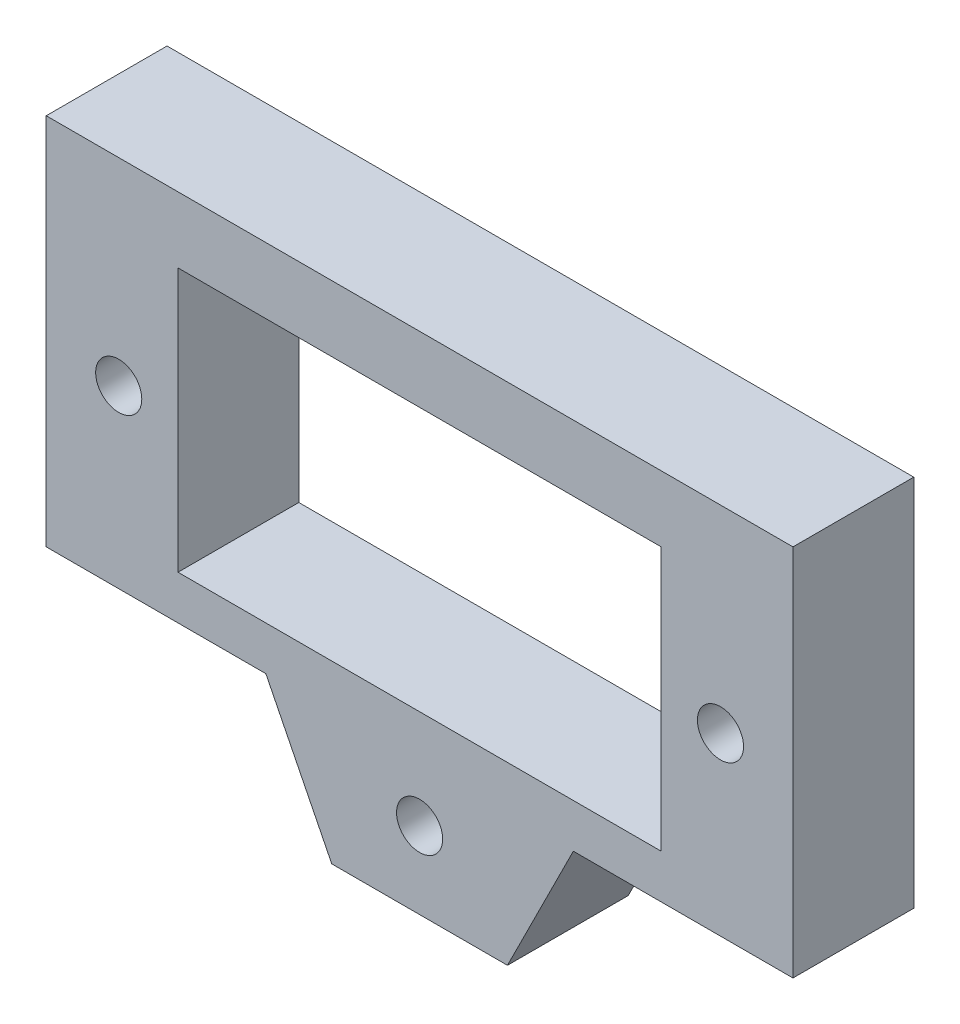
ISO-10303-21;
HEADER;
FILE_DESCRIPTION(('STEP AP214'),'2;1');
FILE_NAME('part.step','',(''),(''),'','','');
FILE_SCHEMA(('AUTOMOTIVE_DESIGN { 1 0 10303 214 1 1 1 1 }'));
ENDSEC;
DATA;
#1=APPLICATION_CONTEXT('core data for automotive mechanical design processes');
#2=APPLICATION_PROTOCOL_DEFINITION('international standard','automotive_design',2000,#1);
#3=PRODUCT_CONTEXT('',#1,'mechanical');
#4=PRODUCT('Part','Part','',(#3));
#5=PRODUCT_RELATED_PRODUCT_CATEGORY('part','',(#4));
#6=PRODUCT_DEFINITION_FORMATION('','',#4);
#7=PRODUCT_DEFINITION_CONTEXT('part definition',#1,'design');
#8=PRODUCT_DEFINITION('design','',#6,#7);
#9=PRODUCT_DEFINITION_SHAPE('','',#8);
#10=(LENGTH_UNIT() NAMED_UNIT(*) SI_UNIT(.MILLI.,.METRE.));
#11=(NAMED_UNIT(*) PLANE_ANGLE_UNIT() SI_UNIT($,.RADIAN.));
#12=(NAMED_UNIT(*) SI_UNIT($,.STERADIAN.) SOLID_ANGLE_UNIT());
#13=UNCERTAINTY_MEASURE_WITH_UNIT(LENGTH_MEASURE(1.E-05),#10,'distance_accuracy_value','');
#14=(GEOMETRIC_REPRESENTATION_CONTEXT(3) GLOBAL_UNCERTAINTY_ASSIGNED_CONTEXT((#13)) GLOBAL_UNIT_ASSIGNED_CONTEXT((#10,
#11,#12)) REPRESENTATION_CONTEXT('',''));
#15=CARTESIAN_POINT('',(0.,0.,0.));
#16=DIRECTION('',(0.,0.,1.));
#17=DIRECTION('',(1.,0.,0.));
#18=AXIS2_PLACEMENT_3D('',#15,#16,#17);
#19=CARTESIAN_POINT('',(0.,0.,5.5));
#20=DIRECTION('',(0.,0.,1.));
#21=DIRECTION('',(1.,0.,0.));
#22=AXIS2_PLACEMENT_3D('',#19,#20,#21);
#23=PLANE('',#22);
#24=CARTESIAN_POINT('',(13.7,0.,5.5));
#25=DIRECTION('',(0.,0.,1.));
#26=DIRECTION('',(1.,0.,0.));
#27=AXIS2_PLACEMENT_3D('',#24,#25,#26);
#28=CIRCLE('',#27,1.05);
#29=CARTESIAN_POINT('',(14.75,0.,5.5));
#30=VERTEX_POINT('',#29);
#31=EDGE_CURVE('E313',#30,#30,#28,.T.);
#32=ORIENTED_EDGE('',*,*,#31,.F.);
#33=EDGE_LOOP('',(#32));
#34=FACE_BOUND('',#33,.T.);
#35=DIRECTION('',(1.,0.,0.));
#36=VECTOR('',#35,1.);
#37=CARTESIAN_POINT('',(11.,-6.,5.5));
#38=LINE('',#37,#36);
#39=CARTESIAN_POINT('',(-11.,-6.,5.5));
#40=VERTEX_POINT('',#39);
#41=CARTESIAN_POINT('',(11.,-6.,5.5));
#42=VERTEX_POINT('',#41);
#43=EDGE_CURVE('E129',#40,#42,#38,.T.);
#44=ORIENTED_EDGE('',*,*,#43,.F.);
#45=DIRECTION('',(0.,-1.,0.));
#46=VECTOR('',#45,1.);
#47=CARTESIAN_POINT('',(-11.,6.,5.5));
#48=LINE('',#47,#46);
#49=CARTESIAN_POINT('',(-11.,6.,5.5));
#50=VERTEX_POINT('',#49);
#51=EDGE_CURVE('E121',#50,#40,#48,.T.);
#52=ORIENTED_EDGE('',*,*,#51,.F.);
#53=DIRECTION('',(-1.,0.,0.));
#54=VECTOR('',#53,1.);
#55=CARTESIAN_POINT('',(11.,6.,5.5));
#56=LINE('',#55,#54);
#57=CARTESIAN_POINT('',(11.,6.,5.5));
#58=VERTEX_POINT('',#57);
#59=EDGE_CURVE('E144',#58,#50,#56,.T.);
#60=ORIENTED_EDGE('',*,*,#59,.F.);
#61=DIRECTION('',(0.,1.,0.));
#62=VECTOR('',#61,1.);
#63=CARTESIAN_POINT('',(11.,6.,5.5));
#64=LINE('',#63,#62);
#65=EDGE_CURVE('E142',#42,#58,#64,.T.);
#66=ORIENTED_EDGE('',*,*,#65,.F.);
#67=EDGE_LOOP('',(#44,#52,#60,#66));
#68=FACE_BOUND('',#67,.T.);
#69=DIRECTION('',(0.,-1.,0.));
#70=VECTOR('',#69,1.);
#71=CARTESIAN_POINT('',(-17.,9.,5.5));
#72=LINE('',#71,#70);
#73=CARTESIAN_POINT('',(-17.,9.,5.5));
#74=VERTEX_POINT('',#73);
#75=CARTESIAN_POINT('',(-17.,-8.,5.5));
#76=VERTEX_POINT('',#75);
#77=EDGE_CURVE('E160',#74,#76,#72,.T.);
#78=ORIENTED_EDGE('',*,*,#77,.T.);
#79=DIRECTION('',(1.,0.,0.));
#80=VECTOR('',#79,1.);
#81=CARTESIAN_POINT('',(-17.,-8.,5.5));
#82=LINE('',#81,#80);
#83=CARTESIAN_POINT('',(-7.,-8.,5.5));
#84=VERTEX_POINT('',#83);
#85=EDGE_CURVE('E163',#76,#84,#82,.T.);
#86=ORIENTED_EDGE('',*,*,#85,.T.);
#87=DIRECTION('',(0.447213595499958,-0.894427190999916,0.));
#88=VECTOR('',#87,1.);
#89=CARTESIAN_POINT('',(-7.,-8.,5.5));
#90=LINE('',#89,#88);
#91=CARTESIAN_POINT('',(-4.,-14.,5.5));
#92=VERTEX_POINT('',#91);
#93=EDGE_CURVE('E166',#84,#92,#90,.T.);
#94=ORIENTED_EDGE('',*,*,#93,.T.);
#95=DIRECTION('',(1.,0.,0.));
#96=VECTOR('',#95,1.);
#97=CARTESIAN_POINT('',(-4.,-14.,5.5));
#98=LINE('',#97,#96);
#99=CARTESIAN_POINT('',(4.,-14.,5.5));
#100=VERTEX_POINT('',#99);
#101=EDGE_CURVE('E168',#92,#100,#98,.T.);
#102=ORIENTED_EDGE('',*,*,#101,.T.);
#103=DIRECTION('',(0.447213595499957,0.894427190999916,0.));
#104=VECTOR('',#103,1.);
#105=CARTESIAN_POINT('',(4.,-14.,5.5));
#106=LINE('',#105,#104);
#107=CARTESIAN_POINT('',(6.99999999999999,-8.,5.5));
#108=VERTEX_POINT('',#107);
#109=EDGE_CURVE('E170',#100,#108,#106,.T.);
#110=ORIENTED_EDGE('',*,*,#109,.T.);
#111=DIRECTION('',(1.,0.,0.));
#112=VECTOR('',#111,1.);
#113=CARTESIAN_POINT('',(6.99999999999999,-8.,5.5));
#114=LINE('',#113,#112);
#115=CARTESIAN_POINT('',(17.,-8.,5.5));
#116=VERTEX_POINT('',#115);
#117=EDGE_CURVE('E172',#108,#116,#114,.T.);
#118=ORIENTED_EDGE('',*,*,#117,.T.);
#119=DIRECTION('',(0.,1.,0.));
#120=VECTOR('',#119,1.);
#121=CARTESIAN_POINT('',(17.,9.,5.5));
#122=LINE('',#121,#120);
#123=CARTESIAN_POINT('',(17.,9.,5.5));
#124=VERTEX_POINT('',#123);
#125=EDGE_CURVE('E174',#116,#124,#122,.T.);
#126=ORIENTED_EDGE('',*,*,#125,.T.);
#127=DIRECTION('',(-1.,0.,0.));
#128=VECTOR('',#127,1.);
#129=CARTESIAN_POINT('',(-17.,9.,5.5));
#130=LINE('',#129,#128);
#131=EDGE_CURVE('E176',#124,#74,#130,.T.);
#132=ORIENTED_EDGE('',*,*,#131,.T.);
#133=EDGE_LOOP('',(#78,#86,#94,#102,#110,#118,#126,#132));
#134=FACE_BOUND('',#133,.T.);
#135=CARTESIAN_POINT('',(-13.7,0.,5.5));
#136=DIRECTION('',(0.,0.,1.));
#137=DIRECTION('',(1.,0.,0.));
#138=AXIS2_PLACEMENT_3D('',#135,#136,#137);
#139=CIRCLE('',#138,1.05);
#140=CARTESIAN_POINT('',(-12.65,0.,5.5));
#141=VERTEX_POINT('',#140);
#142=EDGE_CURVE('E150',#141,#141,#139,.T.);
#143=ORIENTED_EDGE('',*,*,#142,.F.);
#144=EDGE_LOOP('',(#143));
#145=FACE_BOUND('',#144,.T.);
#146=CARTESIAN_POINT('',(0.,-10.5,5.5));
#147=DIRECTION('',(0.,0.,1.));
#148=DIRECTION('',(1.,0.,0.));
#149=AXIS2_PLACEMENT_3D('',#146,#147,#148);
#150=CIRCLE('',#149,1.05);
#151=CARTESIAN_POINT('',(1.05,-10.5,5.5));
#152=VERTEX_POINT('',#151);
#153=EDGE_CURVE('E304',#152,#152,#150,.T.);
#154=ORIENTED_EDGE('',*,*,#153,.F.);
#155=EDGE_LOOP('',(#154));
#156=FACE_BOUND('',#155,.T.);
#157=ADVANCED_FACE('F32',(#34,#68,#134,#145,#156),#23,.T.);
#158=CARTESIAN_POINT('',(0.,0.,0.));
#159=DIRECTION('',(0.,0.,1.));
#160=DIRECTION('',(1.,0.,0.));
#161=AXIS2_PLACEMENT_3D('',#158,#159,#160);
#162=PLANE('',#161);
#163=DIRECTION('',(0.,-1.,0.));
#164=VECTOR('',#163,1.);
#165=CARTESIAN_POINT('',(-17.,9.,0.));
#166=LINE('',#165,#164);
#167=CARTESIAN_POINT('',(-17.,9.,0.));
#168=VERTEX_POINT('',#167);
#169=CARTESIAN_POINT('',(-17.,-8.,0.));
#170=VERTEX_POINT('',#169);
#171=EDGE_CURVE('E137',#168,#170,#166,.T.);
#172=ORIENTED_EDGE('',*,*,#171,.F.);
#173=DIRECTION('',(-1.,0.,0.));
#174=VECTOR('',#173,1.);
#175=CARTESIAN_POINT('',(-17.,9.,0.));
#176=LINE('',#175,#174);
#177=CARTESIAN_POINT('',(17.,9.,0.));
#178=VERTEX_POINT('',#177);
#179=EDGE_CURVE('E164',#178,#168,#176,.T.);
#180=ORIENTED_EDGE('',*,*,#179,.F.);
#181=DIRECTION('',(0.,1.,0.));
#182=VECTOR('',#181,1.);
#183=CARTESIAN_POINT('',(17.,9.,0.));
#184=LINE('',#183,#182);
#185=CARTESIAN_POINT('',(17.,-8.,0.));
#186=VERTEX_POINT('',#185);
#187=EDGE_CURVE('E191',#186,#178,#184,.T.);
#188=ORIENTED_EDGE('',*,*,#187,.F.);
#189=DIRECTION('',(1.,0.,0.));
#190=VECTOR('',#189,1.);
#191=CARTESIAN_POINT('',(6.99999999999999,-8.,0.));
#192=LINE('',#191,#190);
#193=CARTESIAN_POINT('',(6.99999999999999,-8.,0.));
#194=VERTEX_POINT('',#193);
#195=EDGE_CURVE('E189',#194,#186,#192,.T.);
#196=ORIENTED_EDGE('',*,*,#195,.F.);
#197=DIRECTION('',(0.447213595499957,0.894427190999916,0.));
#198=VECTOR('',#197,1.);
#199=CARTESIAN_POINT('',(4.,-14.,0.));
#200=LINE('',#199,#198);
#201=CARTESIAN_POINT('',(4.,-14.,0.));
#202=VERTEX_POINT('',#201);
#203=EDGE_CURVE('E187',#202,#194,#200,.T.);
#204=ORIENTED_EDGE('',*,*,#203,.F.);
#205=DIRECTION('',(1.,0.,0.));
#206=VECTOR('',#205,1.);
#207=CARTESIAN_POINT('',(-4.,-14.,0.));
#208=LINE('',#207,#206);
#209=CARTESIAN_POINT('',(-4.,-14.,0.));
#210=VERTEX_POINT('',#209);
#211=EDGE_CURVE('E185',#210,#202,#208,.T.);
#212=ORIENTED_EDGE('',*,*,#211,.F.);
#213=DIRECTION('',(0.447213595499958,-0.894427190999916,0.));
#214=VECTOR('',#213,1.);
#215=CARTESIAN_POINT('',(-7.,-8.,0.));
#216=LINE('',#215,#214);
#217=CARTESIAN_POINT('',(-7.,-8.,0.));
#218=VERTEX_POINT('',#217);
#219=EDGE_CURVE('E183',#218,#210,#216,.T.);
#220=ORIENTED_EDGE('',*,*,#219,.F.);
#221=DIRECTION('',(1.,0.,0.));
#222=VECTOR('',#221,1.);
#223=CARTESIAN_POINT('',(-17.,-8.,0.));
#224=LINE('',#223,#222);
#225=EDGE_CURVE('E181',#170,#218,#224,.T.);
#226=ORIENTED_EDGE('',*,*,#225,.F.);
#227=EDGE_LOOP('',(#172,#180,#188,#196,#204,#212,#220,#226));
#228=FACE_BOUND('',#227,.T.);
#229=DIRECTION('',(0.,-1.,0.));
#230=VECTOR('',#229,1.);
#231=CARTESIAN_POINT('',(-11.,6.,0.));
#232=LINE('',#231,#230);
#233=CARTESIAN_POINT('',(-11.,6.,0.));
#234=VERTEX_POINT('',#233);
#235=CARTESIAN_POINT('',(-11.,-6.,0.));
#236=VERTEX_POINT('',#235);
#237=EDGE_CURVE('E55',#234,#236,#232,.T.);
#238=ORIENTED_EDGE('',*,*,#237,.T.);
#239=DIRECTION('',(1.,0.,0.));
#240=VECTOR('',#239,1.);
#241=CARTESIAN_POINT('',(11.,-6.,0.));
#242=LINE('',#241,#240);
#243=CARTESIAN_POINT('',(11.,-6.,0.));
#244=VERTEX_POINT('',#243);
#245=EDGE_CURVE('E136',#236,#244,#242,.T.);
#246=ORIENTED_EDGE('',*,*,#245,.T.);
#247=DIRECTION('',(0.,1.,0.));
#248=VECTOR('',#247,1.);
#249=CARTESIAN_POINT('',(11.,6.,0.));
#250=LINE('',#249,#248);
#251=CARTESIAN_POINT('',(11.,6.,0.));
#252=VERTEX_POINT('',#251);
#253=EDGE_CURVE('E152',#244,#252,#250,.T.);
#254=ORIENTED_EDGE('',*,*,#253,.T.);
#255=DIRECTION('',(-1.,0.,0.));
#256=VECTOR('',#255,1.);
#257=CARTESIAN_POINT('',(11.,6.,0.));
#258=LINE('',#257,#256);
#259=EDGE_CURVE('E130',#252,#234,#258,.T.);
#260=ORIENTED_EDGE('',*,*,#259,.T.);
#261=EDGE_LOOP('',(#238,#246,#254,#260));
#262=FACE_BOUND('',#261,.T.);
#263=CARTESIAN_POINT('',(-13.7,0.,0.));
#264=DIRECTION('',(0.,0.,1.));
#265=DIRECTION('',(1.,0.,0.));
#266=AXIS2_PLACEMENT_3D('',#263,#264,#265);
#267=CIRCLE('',#266,1.05);
#268=CARTESIAN_POINT('',(-12.65,0.,0.));
#269=VERTEX_POINT('',#268);
#270=EDGE_CURVE('E316',#269,#269,#267,.T.);
#271=ORIENTED_EDGE('',*,*,#270,.T.);
#272=EDGE_LOOP('',(#271));
#273=FACE_BOUND('',#272,.T.);
#274=CARTESIAN_POINT('',(13.7,0.,0.));
#275=DIRECTION('',(0.,0.,1.));
#276=DIRECTION('',(1.,0.,0.));
#277=AXIS2_PLACEMENT_3D('',#274,#275,#276);
#278=CIRCLE('',#277,1.05);
#279=CARTESIAN_POINT('',(14.75,0.,0.));
#280=VERTEX_POINT('',#279);
#281=EDGE_CURVE('E310',#280,#280,#278,.T.);
#282=ORIENTED_EDGE('',*,*,#281,.T.);
#283=EDGE_LOOP('',(#282));
#284=FACE_BOUND('',#283,.T.);
#285=CARTESIAN_POINT('',(0.,-10.5,0.));
#286=DIRECTION('',(0.,0.,1.));
#287=DIRECTION('',(1.,0.,0.));
#288=AXIS2_PLACEMENT_3D('',#285,#286,#287);
#289=CIRCLE('',#288,1.05);
#290=CARTESIAN_POINT('',(1.05,-10.5,0.));
#291=VERTEX_POINT('',#290);
#292=EDGE_CURVE('E307',#291,#291,#289,.T.);
#293=ORIENTED_EDGE('',*,*,#292,.T.);
#294=EDGE_LOOP('',(#293));
#295=FACE_BOUND('',#294,.T.);
#296=ADVANCED_FACE('F221',(#228,#262,#273,#284,#295),#162,.F.);
#297=CARTESIAN_POINT('',(-17.,9.,5.5));
#298=DIRECTION('',(1.,0.,0.));
#299=DIRECTION('',(0.,1.,0.));
#300=AXIS2_PLACEMENT_3D('',#297,#298,#299);
#301=PLANE('',#300);
#302=ORIENTED_EDGE('',*,*,#171,.T.);
#303=DIRECTION('',(0.,0.,-1.));
#304=VECTOR('',#303,1.);
#305=CARTESIAN_POINT('',(-17.,-8.,5.5));
#306=LINE('',#305,#304);
#307=EDGE_CURVE('E11',#76,#170,#306,.T.);
#308=ORIENTED_EDGE('',*,*,#307,.F.);
#309=ORIENTED_EDGE('',*,*,#77,.F.);
#310=DIRECTION('',(0.,0.,-1.));
#311=VECTOR('',#310,1.);
#312=CARTESIAN_POINT('',(-17.,9.,5.5));
#313=LINE('',#312,#311);
#314=EDGE_CURVE('E178',#74,#168,#313,.T.);
#315=ORIENTED_EDGE('',*,*,#314,.T.);
#316=EDGE_LOOP('',(#302,#308,#309,#315));
#317=FACE_BOUND('',#316,.T.);
#318=ADVANCED_FACE('F34',(#317),#301,.F.);
#319=CARTESIAN_POINT('',(-17.,-8.,5.5));
#320=DIRECTION('',(0.,1.,0.));
#321=DIRECTION('',(-1.,0.,0.));
#322=AXIS2_PLACEMENT_3D('',#319,#320,#321);
#323=PLANE('',#322);
#324=ORIENTED_EDGE('',*,*,#225,.T.);
#325=DIRECTION('',(0.,0.,-1.));
#326=VECTOR('',#325,1.);
#327=CARTESIAN_POINT('',(-7.,-8.,5.5));
#328=LINE('',#327,#326);
#329=EDGE_CURVE('E40',#84,#218,#328,.T.);
#330=ORIENTED_EDGE('',*,*,#329,.F.);
#331=ORIENTED_EDGE('',*,*,#85,.F.);
#332=ORIENTED_EDGE('',*,*,#307,.T.);
#333=EDGE_LOOP('',(#324,#330,#331,#332));
#334=FACE_BOUND('',#333,.T.);
#335=ADVANCED_FACE('F238',(#334),#323,.F.);
#336=CARTESIAN_POINT('',(-7.,-8.,5.5));
#337=DIRECTION('',(0.894427190999916,0.447213595499958,0.));
#338=DIRECTION('',(-0.447213595499958,0.894427190999916,0.));
#339=AXIS2_PLACEMENT_3D('',#336,#337,#338);
#340=PLANE('',#339);
#341=ORIENTED_EDGE('',*,*,#219,.T.);
#342=DIRECTION('',(0.,0.,-1.));
#343=VECTOR('',#342,1.);
#344=CARTESIAN_POINT('',(-4.,-14.,5.5));
#345=LINE('',#344,#343);
#346=EDGE_CURVE('E208',#92,#210,#345,.T.);
#347=ORIENTED_EDGE('',*,*,#346,.F.);
#348=ORIENTED_EDGE('',*,*,#93,.F.);
#349=ORIENTED_EDGE('',*,*,#329,.T.);
#350=EDGE_LOOP('',(#341,#347,#348,#349));
#351=FACE_BOUND('',#350,.T.);
#352=ADVANCED_FACE('F215',(#351),#340,.F.);
#353=CARTESIAN_POINT('',(-4.,-14.,5.5));
#354=DIRECTION('',(0.,1.,0.));
#355=DIRECTION('',(0.,0.,1.));
#356=AXIS2_PLACEMENT_3D('',#353,#354,#355);
#357=PLANE('',#356);
#358=ORIENTED_EDGE('',*,*,#211,.T.);
#359=DIRECTION('',(0.,0.,-1.));
#360=VECTOR('',#359,1.);
#361=CARTESIAN_POINT('',(4.,-14.,5.5));
#362=LINE('',#361,#360);
#363=EDGE_CURVE('E205',#100,#202,#362,.T.);
#364=ORIENTED_EDGE('',*,*,#363,.F.);
#365=ORIENTED_EDGE('',*,*,#101,.F.);
#366=ORIENTED_EDGE('',*,*,#346,.T.);
#367=EDGE_LOOP('',(#358,#364,#365,#366));
#368=FACE_BOUND('',#367,.T.);
#369=ADVANCED_FACE('F227',(#368),#357,.F.);
#370=CARTESIAN_POINT('',(4.,-14.,5.5));
#371=DIRECTION('',(-0.894427190999916,0.447213595499957,0.));
#372=DIRECTION('',(-0.447213595499957,-0.894427190999916,0.));
#373=AXIS2_PLACEMENT_3D('',#370,#371,#372);
#374=PLANE('',#373);
#375=ORIENTED_EDGE('',*,*,#203,.T.);
#376=DIRECTION('',(0.,0.,-1.));
#377=VECTOR('',#376,1.);
#378=CARTESIAN_POINT('',(6.99999999999999,-8.,5.5));
#379=LINE('',#378,#377);
#380=EDGE_CURVE('E202',#108,#194,#379,.T.);
#381=ORIENTED_EDGE('',*,*,#380,.F.);
#382=ORIENTED_EDGE('',*,*,#109,.F.);
#383=ORIENTED_EDGE('',*,*,#363,.T.);
#384=EDGE_LOOP('',(#375,#381,#382,#383));
#385=FACE_BOUND('',#384,.T.);
#386=ADVANCED_FACE('F231',(#385),#374,.F.);
#387=CARTESIAN_POINT('',(6.99999999999999,-8.,5.5));
#388=DIRECTION('',(0.,1.,0.));
#389=DIRECTION('',(0.,0.,1.));
#390=AXIS2_PLACEMENT_3D('',#387,#388,#389);
#391=PLANE('',#390);
#392=ORIENTED_EDGE('',*,*,#195,.T.);
#393=DIRECTION('',(0.,0.,-1.));
#394=VECTOR('',#393,1.);
#395=CARTESIAN_POINT('',(17.,-8.,5.5));
#396=LINE('',#395,#394);
#397=EDGE_CURVE('E199',#116,#186,#396,.T.);
#398=ORIENTED_EDGE('',*,*,#397,.F.);
#399=ORIENTED_EDGE('',*,*,#117,.F.);
#400=ORIENTED_EDGE('',*,*,#380,.T.);
#401=EDGE_LOOP('',(#392,#398,#399,#400));
#402=FACE_BOUND('',#401,.T.);
#403=ADVANCED_FACE('F251',(#402),#391,.F.);
#404=CARTESIAN_POINT('',(17.,9.,5.5));
#405=DIRECTION('',(-1.,0.,0.));
#406=DIRECTION('',(0.,-1.,0.));
#407=AXIS2_PLACEMENT_3D('',#404,#405,#406);
#408=PLANE('',#407);
#409=ORIENTED_EDGE('',*,*,#187,.T.);
#410=DIRECTION('',(0.,0.,-1.));
#411=VECTOR('',#410,1.);
#412=CARTESIAN_POINT('',(17.,9.,5.5));
#413=LINE('',#412,#411);
#414=EDGE_CURVE('E196',#124,#178,#413,.T.);
#415=ORIENTED_EDGE('',*,*,#414,.F.);
#416=ORIENTED_EDGE('',*,*,#125,.F.);
#417=ORIENTED_EDGE('',*,*,#397,.T.);
#418=EDGE_LOOP('',(#409,#415,#416,#417));
#419=FACE_BOUND('',#418,.T.);
#420=ADVANCED_FACE('F249',(#419),#408,.F.);
#421=CARTESIAN_POINT('',(-17.,9.,5.5));
#422=DIRECTION('',(0.,-1.,0.));
#423=DIRECTION('',(0.,0.,-1.));
#424=AXIS2_PLACEMENT_3D('',#421,#422,#423);
#425=PLANE('',#424);
#426=ORIENTED_EDGE('',*,*,#179,.T.);
#427=ORIENTED_EDGE('',*,*,#314,.F.);
#428=ORIENTED_EDGE('',*,*,#131,.F.);
#429=ORIENTED_EDGE('',*,*,#414,.T.);
#430=EDGE_LOOP('',(#426,#427,#428,#429));
#431=FACE_BOUND('',#430,.T.);
#432=ADVANCED_FACE('F244',(#431),#425,.F.);
#433=CARTESIAN_POINT('',(-11.,6.,5.5));
#434=DIRECTION('',(1.,0.,0.));
#435=DIRECTION('',(0.,1.,0.));
#436=AXIS2_PLACEMENT_3D('',#433,#434,#435);
#437=PLANE('',#436);
#438=ORIENTED_EDGE('',*,*,#237,.F.);
#439=DIRECTION('',(0.,0.,-1.));
#440=VECTOR('',#439,1.);
#441=CARTESIAN_POINT('',(-11.,6.,5.5));
#442=LINE('',#441,#440);
#443=EDGE_CURVE('E125',#50,#234,#442,.T.);
#444=ORIENTED_EDGE('',*,*,#443,.F.);
#445=ORIENTED_EDGE('',*,*,#51,.T.);
#446=DIRECTION('',(0.,0.,-1.));
#447=VECTOR('',#446,1.);
#448=CARTESIAN_POINT('',(-11.,-6.,5.5));
#449=LINE('',#448,#447);
#450=EDGE_CURVE('E124',#40,#236,#449,.T.);
#451=ORIENTED_EDGE('',*,*,#450,.T.);
#452=EDGE_LOOP('',(#438,#444,#445,#451));
#453=FACE_BOUND('',#452,.T.);
#454=ADVANCED_FACE('F123',(#453),#437,.T.);
#455=CARTESIAN_POINT('',(11.,-6.,5.5));
#456=DIRECTION('',(0.,1.,0.));
#457=DIRECTION('',(-1.,0.,0.));
#458=AXIS2_PLACEMENT_3D('',#455,#456,#457);
#459=PLANE('',#458);
#460=ORIENTED_EDGE('',*,*,#245,.F.);
#461=ORIENTED_EDGE('',*,*,#450,.F.);
#462=ORIENTED_EDGE('',*,*,#43,.T.);
#463=DIRECTION('',(0.,0.,-1.));
#464=VECTOR('',#463,1.);
#465=CARTESIAN_POINT('',(11.,-6.,5.5));
#466=LINE('',#465,#464);
#467=EDGE_CURVE('E138',#42,#244,#466,.T.);
#468=ORIENTED_EDGE('',*,*,#467,.T.);
#469=EDGE_LOOP('',(#460,#461,#462,#468));
#470=FACE_BOUND('',#469,.T.);
#471=ADVANCED_FACE('F133',(#470),#459,.T.);
#472=CARTESIAN_POINT('',(11.,6.,5.5));
#473=DIRECTION('',(-1.,0.,0.));
#474=DIRECTION('',(0.,-1.,0.));
#475=AXIS2_PLACEMENT_3D('',#472,#473,#474);
#476=PLANE('',#475);
#477=ORIENTED_EDGE('',*,*,#253,.F.);
#478=ORIENTED_EDGE('',*,*,#467,.F.);
#479=ORIENTED_EDGE('',*,*,#65,.T.);
#480=DIRECTION('',(0.,0.,-1.));
#481=VECTOR('',#480,1.);
#482=CARTESIAN_POINT('',(11.,6.,5.5));
#483=LINE('',#482,#481);
#484=EDGE_CURVE('E47',#58,#252,#483,.T.);
#485=ORIENTED_EDGE('',*,*,#484,.T.);
#486=EDGE_LOOP('',(#477,#478,#479,#485));
#487=FACE_BOUND('',#486,.T.);
#488=ADVANCED_FACE('F278',(#487),#476,.T.);
#489=CARTESIAN_POINT('',(11.,6.,5.5));
#490=DIRECTION('',(0.,-1.,0.));
#491=DIRECTION('',(1.,0.,0.));
#492=AXIS2_PLACEMENT_3D('',#489,#490,#491);
#493=PLANE('',#492);
#494=ORIENTED_EDGE('',*,*,#259,.F.);
#495=ORIENTED_EDGE('',*,*,#484,.F.);
#496=ORIENTED_EDGE('',*,*,#59,.T.);
#497=ORIENTED_EDGE('',*,*,#443,.T.);
#498=EDGE_LOOP('',(#494,#495,#496,#497));
#499=FACE_BOUND('',#498,.T.);
#500=ADVANCED_FACE('F282',(#499),#493,.T.);
#501=CARTESIAN_POINT('',(-13.7,0.,5.5));
#502=DIRECTION('',(0.,0.,-1.));
#503=DIRECTION('',(-1.,0.,0.));
#504=AXIS2_PLACEMENT_3D('',#501,#502,#503);
#505=CYLINDRICAL_SURFACE('',#504,1.05);
#506=ORIENTED_EDGE('',*,*,#142,.T.);
#507=EDGE_LOOP('',(#506));
#508=FACE_BOUND('',#507,.T.);
#509=ORIENTED_EDGE('',*,*,#270,.F.);
#510=EDGE_LOOP('',(#509));
#511=FACE_BOUND('',#510,.T.);
#512=ADVANCED_FACE('F288',(#508,#511),#505,.F.);
#513=CARTESIAN_POINT('',(13.7,0.,5.5));
#514=DIRECTION('',(0.,0.,-1.));
#515=DIRECTION('',(-1.,0.,0.));
#516=AXIS2_PLACEMENT_3D('',#513,#514,#515);
#517=CYLINDRICAL_SURFACE('',#516,1.05);
#518=ORIENTED_EDGE('',*,*,#31,.T.);
#519=EDGE_LOOP('',(#518));
#520=FACE_BOUND('',#519,.T.);
#521=ORIENTED_EDGE('',*,*,#281,.F.);
#522=EDGE_LOOP('',(#521));
#523=FACE_BOUND('',#522,.T.);
#524=ADVANCED_FACE('F291',(#520,#523),#517,.F.);
#525=CARTESIAN_POINT('',(0.,-10.5,5.5));
#526=DIRECTION('',(0.,0.,-1.));
#527=DIRECTION('',(-1.,0.,0.));
#528=AXIS2_PLACEMENT_3D('',#525,#526,#527);
#529=CYLINDRICAL_SURFACE('',#528,1.05);
#530=ORIENTED_EDGE('',*,*,#153,.T.);
#531=EDGE_LOOP('',(#530));
#532=FACE_BOUND('',#531,.T.);
#533=ORIENTED_EDGE('',*,*,#292,.F.);
#534=EDGE_LOOP('',(#533));
#535=FACE_BOUND('',#534,.T.);
#536=ADVANCED_FACE('F295',(#532,#535),#529,.F.);
#537=CLOSED_SHELL('',(#157,#296,#318,#335,#352,#369,#386,#403,#420,#432,#454,#471,#488,#500,
#512,#524,#536));
#538=MANIFOLD_SOLID_BREP('B2',#537);
#539=ADVANCED_BREP_SHAPE_REPRESENTATION('',(#18,#538),#14);
#540=SHAPE_DEFINITION_REPRESENTATION(#9,#539);
ENDSEC;
END-ISO-10303-21;
